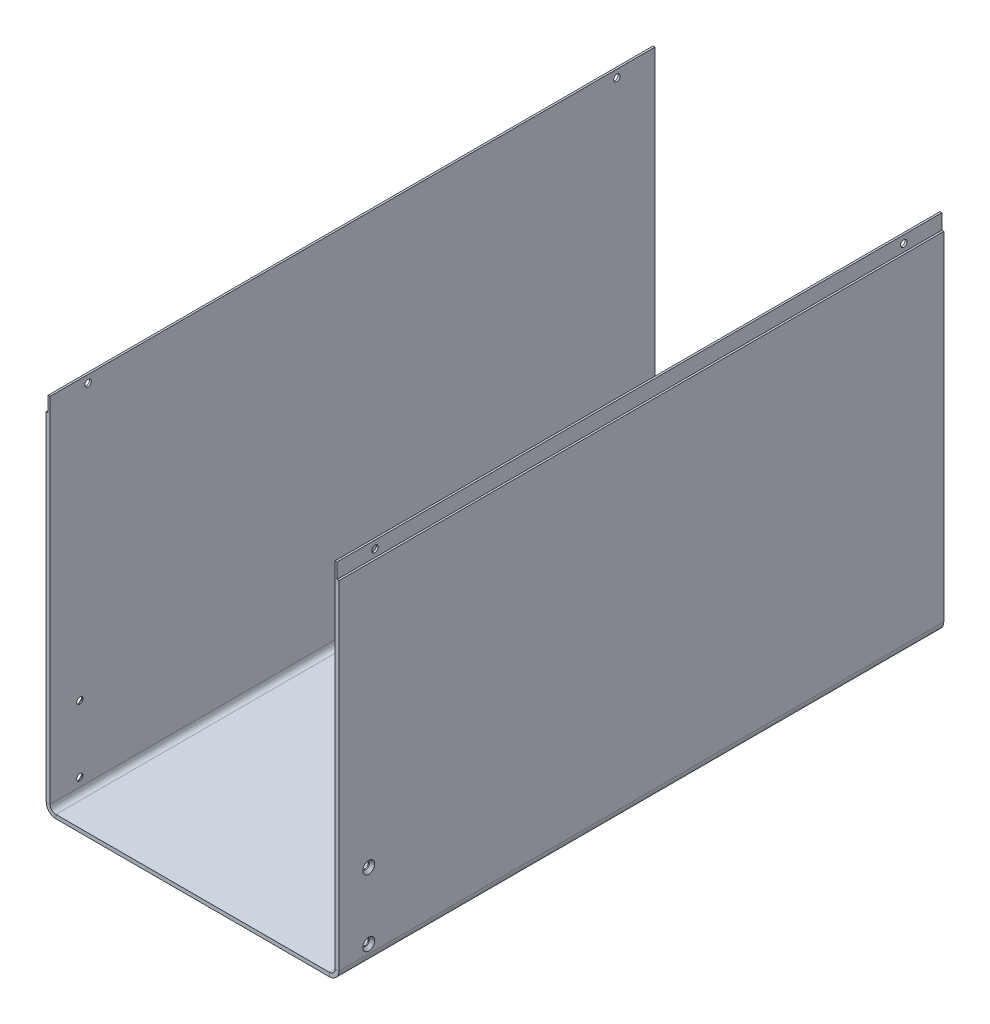
ISO-10303-21;
HEADER;
FILE_DESCRIPTION(('STEP AP214'),'2;1');
FILE_NAME('part.step','',(''),(''),'','','');
FILE_SCHEMA(('AUTOMOTIVE_DESIGN { 1 0 10303 214 1 1 1 1 }'));
ENDSEC;
DATA;
#1=APPLICATION_CONTEXT('core data for automotive mechanical design processes');
#2=APPLICATION_PROTOCOL_DEFINITION('international standard','automotive_design',2000,#1);
#3=PRODUCT_CONTEXT('',#1,'mechanical');
#4=PRODUCT('Part','Part','',(#3));
#5=PRODUCT_RELATED_PRODUCT_CATEGORY('part','',(#4));
#6=PRODUCT_DEFINITION_FORMATION('','',#4);
#7=PRODUCT_DEFINITION_CONTEXT('part definition',#1,'design');
#8=PRODUCT_DEFINITION('design','',#6,#7);
#9=PRODUCT_DEFINITION_SHAPE('','',#8);
#10=(LENGTH_UNIT() NAMED_UNIT(*) SI_UNIT(.MILLI.,.METRE.));
#11=(NAMED_UNIT(*) PLANE_ANGLE_UNIT() SI_UNIT($,.RADIAN.));
#12=(NAMED_UNIT(*) SI_UNIT($,.STERADIAN.) SOLID_ANGLE_UNIT());
#13=UNCERTAINTY_MEASURE_WITH_UNIT(LENGTH_MEASURE(1.E-05),#10,'distance_accuracy_value','');
#14=(GEOMETRIC_REPRESENTATION_CONTEXT(3) GLOBAL_UNCERTAINTY_ASSIGNED_CONTEXT((#13)) GLOBAL_UNIT_ASSIGNED_CONTEXT((#10,
#11,#12)) REPRESENTATION_CONTEXT('',''));
#15=CARTESIAN_POINT('',(0.,0.,0.));
#16=DIRECTION('',(0.,0.,1.));
#17=DIRECTION('',(1.,0.,0.));
#18=AXIS2_PLACEMENT_3D('',#15,#16,#17);
#19=CARTESIAN_POINT('',(-2.032,0.,-318.352799999998));
#20=DIRECTION('',(0.,0.,1.));
#21=DIRECTION('',(1.,0.,0.));
#22=AXIS2_PLACEMENT_3D('',#19,#20,#21);
#23=PLANE('',#22);
#24=DIRECTION('',(-1.,0.,0.));
#25=VECTOR('',#24,1.);
#26=CARTESIAN_POINT('',(-1.01600000000063,181.048,-318.352799999998));
#27=LINE('',#26,#25);
#28=CARTESIAN_POINT('',(-1.01600000000063,181.048,-318.352799999998));
#29=VERTEX_POINT('',#28);
#30=CARTESIAN_POINT('',(-2.03200000000063,181.048,-318.352799999998));
#31=VERTEX_POINT('',#30);
#32=EDGE_CURVE('E170',#29,#31,#27,.T.);
#33=ORIENTED_EDGE('',*,*,#32,.F.);
#34=DIRECTION('',(0.,1.,0.));
#35=VECTOR('',#34,1.);
#36=CARTESIAN_POINT('',(-1.01600000000066,189.048,-318.352799999998));
#37=LINE('',#36,#35);
#38=CARTESIAN_POINT('',(-1.01600000000066,189.048,-318.352799999998));
#39=VERTEX_POINT('',#38);
#40=EDGE_CURVE('E157',#29,#39,#37,.T.);
#41=ORIENTED_EDGE('',*,*,#40,.T.);
#42=DIRECTION('',(1.,0.,0.));
#43=VECTOR('',#42,1.);
#44=CARTESIAN_POINT('',(-2.03200000000066,189.048,-318.352799999998));
#45=LINE('',#44,#43);
#46=CARTESIAN_POINT('',(-6.60057564145617E-13,189.048,-318.352799999998));
#47=VERTEX_POINT('',#46);
#48=EDGE_CURVE('E217',#39,#47,#45,.T.);
#49=ORIENTED_EDGE('',*,*,#48,.T.);
#50=DIRECTION('',(0.,-1.,0.));
#51=VECTOR('',#50,1.);
#52=CARTESIAN_POINT('',(0.,0.,-318.352799999998));
#53=LINE('',#52,#51);
#54=CARTESIAN_POINT('',(0.,3.04799999999999,-318.352799999998));
#55=VERTEX_POINT('',#54);
#56=EDGE_CURVE('E211',#47,#55,#53,.T.);
#57=ORIENTED_EDGE('',*,*,#56,.T.);
#58=DIRECTION('',(-1.,0.,0.));
#59=VECTOR('',#58,1.);
#60=CARTESIAN_POINT('',(0.,3.04799999999999,-318.352799999998));
#61=LINE('',#60,#59);
#62=CARTESIAN_POINT('',(-2.03200000000001,3.04799999999998,-318.352799999998));
#63=VERTEX_POINT('',#62);
#64=EDGE_CURVE('E199',#55,#63,#61,.T.);
#65=ORIENTED_EDGE('',*,*,#64,.T.);
#66=DIRECTION('',(0.,-1.,0.));
#67=VECTOR('',#66,1.);
#68=CARTESIAN_POINT('',(-2.032,0.,-318.352799999998));
#69=LINE('',#68,#67);
#70=EDGE_CURVE('E212',#31,#63,#69,.T.);
#71=ORIENTED_EDGE('',*,*,#70,.F.);
#72=EDGE_LOOP('',(#33,#41,#49,#57,#65,#71));
#73=FACE_BOUND('',#72,.T.);
#74=ADVANCED_FACE('F39',(#73),#23,.F.);
#75=CARTESIAN_POINT('',(-2.03200000000066,189.048,0.));
#76=DIRECTION('',(0.,0.,-1.));
#77=DIRECTION('',(-1.,0.,0.));
#78=AXIS2_PLACEMENT_3D('',#75,#76,#77);
#79=PLANE('',#78);
#80=DIRECTION('',(-1.,0.,0.));
#81=VECTOR('',#80,1.);
#82=CARTESIAN_POINT('',(-1.01600000000063,181.048,-1.1145598333151E-13));
#83=LINE('',#82,#81);
#84=CARTESIAN_POINT('',(-1.01600000000063,181.048,-1.1145598333151E-13));
#85=VERTEX_POINT('',#84);
#86=CARTESIAN_POINT('',(-2.03200000000063,181.048,-1.1145598333151E-13));
#87=VERTEX_POINT('',#86);
#88=EDGE_CURVE('E162',#85,#87,#83,.T.);
#89=ORIENTED_EDGE('',*,*,#88,.T.);
#90=DIRECTION('',(0.,1.,0.));
#91=VECTOR('',#90,1.);
#92=CARTESIAN_POINT('',(-2.03200000000066,189.048,0.));
#93=LINE('',#92,#91);
#94=CARTESIAN_POINT('',(-2.03200000000001,3.04799999999998,0.));
#95=VERTEX_POINT('',#94);
#96=EDGE_CURVE('E214',#95,#87,#93,.T.);
#97=ORIENTED_EDGE('',*,*,#96,.F.);
#98=DIRECTION('',(-1.,0.,0.));
#99=VECTOR('',#98,1.);
#100=CARTESIAN_POINT('',(0.,3.04799999999999,0.));
#101=LINE('',#100,#99);
#102=CARTESIAN_POINT('',(0.,3.04799999999999,0.));
#103=VERTEX_POINT('',#102);
#104=EDGE_CURVE('E203',#103,#95,#101,.T.);
#105=ORIENTED_EDGE('',*,*,#104,.F.);
#106=DIRECTION('',(0.,1.,0.));
#107=VECTOR('',#106,1.);
#108=CARTESIAN_POINT('',(-6.60057564145617E-13,189.048,0.));
#109=LINE('',#108,#107);
#110=CARTESIAN_POINT('',(-6.60057564145617E-13,189.048,0.));
#111=VERTEX_POINT('',#110);
#112=EDGE_CURVE('E220',#103,#111,#109,.T.);
#113=ORIENTED_EDGE('',*,*,#112,.T.);
#114=DIRECTION('',(1.,0.,0.));
#115=VECTOR('',#114,1.);
#116=CARTESIAN_POINT('',(-2.03200000000066,189.048,0.));
#117=LINE('',#116,#115);
#118=CARTESIAN_POINT('',(-1.01600000000066,189.048,0.));
#119=VERTEX_POINT('',#118);
#120=EDGE_CURVE('E175',#119,#111,#117,.T.);
#121=ORIENTED_EDGE('',*,*,#120,.F.);
#122=DIRECTION('',(0.,-1.,0.));
#123=VECTOR('',#122,1.);
#124=CARTESIAN_POINT('',(-1.01600000000066,189.048,-1.11022302462516E-13));
#125=LINE('',#124,#123);
#126=EDGE_CURVE('E56',#119,#85,#125,.T.);
#127=ORIENTED_EDGE('',*,*,#126,.T.);
#128=EDGE_LOOP('',(#89,#97,#105,#113,#121,#127));
#129=FACE_BOUND('',#128,.T.);
#130=ADVANCED_FACE('F173',(#129),#79,.F.);
#131=CARTESIAN_POINT('',(-2.032,0.,0.));
#132=DIRECTION('',(1.,0.,0.));
#133=DIRECTION('',(0.,1.,0.));
#134=AXIS2_PLACEMENT_3D('',#131,#132,#133);
#135=PLANE('',#134);
#136=CARTESIAN_POINT('',(-2.03200000000015,42.4999999999976,-15.7003999999974));
#137=DIRECTION('',(-1.,0.,0.));
#138=DIRECTION('',(0.,0.,1.));
#139=AXIS2_PLACEMENT_3D('',#136,#137,#138);
#140=CIRCLE('',#139,3.15);
#141=CARTESIAN_POINT('',(-2.03200000000015,42.4999999999976,-12.5503999999974));
#142=VERTEX_POINT('',#141);
#143=EDGE_CURVE('E756',#142,#142,#140,.T.);
#144=ORIENTED_EDGE('',*,*,#143,.F.);
#145=EDGE_LOOP('',(#144));
#146=FACE_BOUND('',#145,.T.);
#147=CARTESIAN_POINT('',(-2.03200000000003,7.49999999999755,-15.7003999999974));
#148=DIRECTION('',(-1.,0.,0.));
#149=DIRECTION('',(0.,0.,1.));
#150=AXIS2_PLACEMENT_3D('',#147,#148,#149);
#151=CIRCLE('',#150,3.15);
#152=CARTESIAN_POINT('',(-2.03200000000003,7.49999999999755,-12.5503999999974));
#153=VERTEX_POINT('',#152);
#154=EDGE_CURVE('E760',#153,#153,#151,.T.);
#155=ORIENTED_EDGE('',*,*,#154,.F.);
#156=EDGE_LOOP('',(#155));
#157=FACE_BOUND('',#156,.T.);
#158=DIRECTION('',(0.,0.,-1.));
#159=VECTOR('',#158,1.);
#160=CARTESIAN_POINT('',(-2.03200000000063,181.048,-1.1145598333151E-13));
#161=LINE('',#160,#159);
#162=EDGE_CURVE('E165',#87,#31,#161,.T.);
#163=ORIENTED_EDGE('',*,*,#162,.T.);
#164=ORIENTED_EDGE('',*,*,#70,.T.);
#165=DIRECTION('',(0.,0.,-1.));
#166=VECTOR('',#165,1.);
#167=CARTESIAN_POINT('',(-2.03200000000001,3.04799999999998,0.));
#168=LINE('',#167,#166);
#169=EDGE_CURVE('E206',#95,#63,#168,.T.);
#170=ORIENTED_EDGE('',*,*,#169,.F.);
#171=ORIENTED_EDGE('',*,*,#96,.T.);
#172=EDGE_LOOP('',(#163,#164,#170,#171));
#173=FACE_BOUND('',#172,.T.);
#174=ADVANCED_FACE('F380',(#146,#157,#173),#135,.F.);
#175=CARTESIAN_POINT('',(152.032000000001,189.048,0.));
#176=DIRECTION('',(0.,-1.,0.));
#177=DIRECTION('',(1.,0.,0.));
#178=AXIS2_PLACEMENT_3D('',#175,#176,#177);
#179=PLANE('',#178);
#180=DIRECTION('',(0.,0.,1.));
#181=VECTOR('',#180,1.);
#182=CARTESIAN_POINT('',(151.016000000001,189.048,0.));
#183=LINE('',#182,#181);
#184=CARTESIAN_POINT('',(151.016000000001,189.048,-318.352799999998));
#185=VERTEX_POINT('',#184);
#186=CARTESIAN_POINT('',(151.016000000001,189.048,0.));
#187=VERTEX_POINT('',#186);
#188=EDGE_CURVE('E192',#185,#187,#183,.T.);
#189=ORIENTED_EDGE('',*,*,#188,.F.);
#190=DIRECTION('',(-1.,0.,0.));
#191=VECTOR('',#190,1.);
#192=CARTESIAN_POINT('',(152.032000000001,189.048,-318.352799999998));
#193=LINE('',#192,#191);
#194=CARTESIAN_POINT('',(150.000000000001,189.048,-318.352799999998));
#195=VERTEX_POINT('',#194);
#196=EDGE_CURVE('E276',#185,#195,#193,.T.);
#197=ORIENTED_EDGE('',*,*,#196,.T.);
#198=DIRECTION('',(0.,0.,1.));
#199=VECTOR('',#198,1.);
#200=CARTESIAN_POINT('',(150.000000000001,189.048,0.));
#201=LINE('',#200,#199);
#202=CARTESIAN_POINT('',(150.000000000001,189.048,0.));
#203=VERTEX_POINT('',#202);
#204=EDGE_CURVE('E270',#195,#203,#201,.T.);
#205=ORIENTED_EDGE('',*,*,#204,.T.);
#206=DIRECTION('',(-1.,0.,0.));
#207=VECTOR('',#206,1.);
#208=CARTESIAN_POINT('',(152.032000000001,189.048,0.));
#209=LINE('',#208,#207);
#210=EDGE_CURVE('E267',#187,#203,#209,.T.);
#211=ORIENTED_EDGE('',*,*,#210,.F.);
#212=EDGE_LOOP('',(#189,#197,#205,#211));
#213=FACE_BOUND('',#212,.T.);
#214=ADVANCED_FACE('F351',(#213),#179,.F.);
#215=CARTESIAN_POINT('',(0.,-2.032,0.));
#216=DIRECTION('',(0.,-1.,0.));
#217=DIRECTION('',(0.,0.,-1.));
#218=AXIS2_PLACEMENT_3D('',#215,#216,#217);
#219=PLANE('',#218);
#220=DIRECTION('',(1.,0.,0.));
#221=VECTOR('',#220,1.);
#222=CARTESIAN_POINT('',(0.,-2.032,0.));
#223=LINE('',#222,#221);
#224=CARTESIAN_POINT('',(3.048,-2.03200000000001,0.));
#225=VERTEX_POINT('',#224);
#226=CARTESIAN_POINT('',(146.952,-2.032,0.));
#227=VERTEX_POINT('',#226);
#228=EDGE_CURVE('E48',#225,#227,#223,.T.);
#229=ORIENTED_EDGE('',*,*,#228,.F.);
#230=DIRECTION('',(0.,0.,1.));
#231=VECTOR('',#230,1.);
#232=CARTESIAN_POINT('',(3.048,-2.03200000000001,0.));
#233=LINE('',#232,#231);
#234=CARTESIAN_POINT('',(3.04800000000001,-2.032,-318.352799999998));
#235=VERTEX_POINT('',#234);
#236=EDGE_CURVE('E227',#225,#235,#233,.F.);
#237=ORIENTED_EDGE('',*,*,#236,.T.);
#238=DIRECTION('',(-1.,0.,0.));
#239=VECTOR('',#238,1.);
#240=CARTESIAN_POINT('',(0.,-2.032,-318.352799999998));
#241=LINE('',#240,#239);
#242=CARTESIAN_POINT('',(146.952,-2.03199999999996,-318.352799999998));
#243=VERTEX_POINT('',#242);
#244=EDGE_CURVE('E11',#243,#235,#241,.T.);
#245=ORIENTED_EDGE('',*,*,#244,.F.);
#246=DIRECTION('',(0.,0.,-1.));
#247=VECTOR('',#246,1.);
#248=CARTESIAN_POINT('',(146.952,-2.03199999999996,-318.352799999998));
#249=LINE('',#248,#247);
#250=EDGE_CURVE('E279',#243,#227,#249,.F.);
#251=ORIENTED_EDGE('',*,*,#250,.T.);
#252=EDGE_LOOP('',(#229,#237,#245,#251));
#253=FACE_BOUND('',#252,.T.);
#254=ADVANCED_FACE('F322',(#253),#219,.T.);
#255=CARTESIAN_POINT('',(0.,0.,0.));
#256=DIRECTION('',(0.,-1.,0.));
#257=DIRECTION('',(0.,0.,-1.));
#258=AXIS2_PLACEMENT_3D('',#255,#256,#257);
#259=PLANE('',#258);
#260=DIRECTION('',(0.,0.,1.));
#261=VECTOR('',#260,1.);
#262=CARTESIAN_POINT('',(3.04799999999999,0.,0.));
#263=LINE('',#262,#261);
#264=CARTESIAN_POINT('',(3.04799999999999,0.,0.));
#265=VERTEX_POINT('',#264);
#266=CARTESIAN_POINT('',(3.04800000000001,0.,-318.352799999998));
#267=VERTEX_POINT('',#266);
#268=EDGE_CURVE('E240',#265,#267,#263,.F.);
#269=ORIENTED_EDGE('',*,*,#268,.F.);
#270=DIRECTION('',(1.,0.,0.));
#271=VECTOR('',#270,1.);
#272=CARTESIAN_POINT('',(0.,0.,0.));
#273=LINE('',#272,#271);
#274=CARTESIAN_POINT('',(146.952,0.,0.));
#275=VERTEX_POINT('',#274);
#276=EDGE_CURVE('E299',#265,#275,#273,.T.);
#277=ORIENTED_EDGE('',*,*,#276,.T.);
#278=DIRECTION('',(0.,0.,-1.));
#279=VECTOR('',#278,1.);
#280=CARTESIAN_POINT('',(146.952,0.,-318.352799999998));
#281=LINE('',#280,#279);
#282=CARTESIAN_POINT('',(146.952,0.,-318.352799999998));
#283=VERTEX_POINT('',#282);
#284=EDGE_CURVE('E292',#283,#275,#281,.F.);
#285=ORIENTED_EDGE('',*,*,#284,.F.);
#286=DIRECTION('',(-1.,0.,0.));
#287=VECTOR('',#286,1.);
#288=CARTESIAN_POINT('',(0.,0.,-318.352799999998));
#289=LINE('',#288,#287);
#290=EDGE_CURVE('E303',#283,#267,#289,.T.);
#291=ORIENTED_EDGE('',*,*,#290,.T.);
#292=EDGE_LOOP('',(#269,#277,#285,#291));
#293=FACE_BOUND('',#292,.T.);
#294=ADVANCED_FACE('F311',(#293),#259,.F.);
#295=CARTESIAN_POINT('',(0.,-2.032,0.));
#296=DIRECTION('',(0.,0.,1.));
#297=DIRECTION('',(1.,0.,0.));
#298=AXIS2_PLACEMENT_3D('',#295,#296,#297);
#299=PLANE('',#298);
#300=ORIENTED_EDGE('',*,*,#276,.F.);
#301=DIRECTION('',(0.,-1.,0.));
#302=VECTOR('',#301,1.);
#303=CARTESIAN_POINT('',(3.04799999999999,0.,0.));
#304=LINE('',#303,#302);
#305=EDGE_CURVE('E234',#265,#225,#304,.T.);
#306=ORIENTED_EDGE('',*,*,#305,.T.);
#307=ORIENTED_EDGE('',*,*,#228,.T.);
#308=DIRECTION('',(0.,-1.,0.));
#309=VECTOR('',#308,1.);
#310=CARTESIAN_POINT('',(146.952,0.,0.));
#311=LINE('',#310,#309);
#312=EDGE_CURVE('E296',#275,#227,#311,.T.);
#313=ORIENTED_EDGE('',*,*,#312,.F.);
#314=EDGE_LOOP('',(#300,#306,#307,#313));
#315=FACE_BOUND('',#314,.T.);
#316=ADVANCED_FACE('F41',(#315),#299,.T.);
#317=CARTESIAN_POINT('',(0.,-2.032,-318.352799999998));
#318=DIRECTION('',(0.,0.,-1.));
#319=DIRECTION('',(-1.,0.,0.));
#320=AXIS2_PLACEMENT_3D('',#317,#318,#319);
#321=PLANE('',#320);
#322=DIRECTION('',(0.,-1.,0.));
#323=VECTOR('',#322,1.);
#324=CARTESIAN_POINT('',(3.04800000000001,0.,-318.352799999998));
#325=LINE('',#324,#323);
#326=EDGE_CURVE('E244',#267,#235,#325,.T.);
#327=ORIENTED_EDGE('',*,*,#326,.F.);
#328=ORIENTED_EDGE('',*,*,#290,.F.);
#329=DIRECTION('',(0.,-1.,0.));
#330=VECTOR('',#329,1.);
#331=CARTESIAN_POINT('',(146.952,0.,-318.352799999998));
#332=LINE('',#331,#330);
#333=EDGE_CURVE('E286',#283,#243,#332,.T.);
#334=ORIENTED_EDGE('',*,*,#333,.T.);
#335=ORIENTED_EDGE('',*,*,#244,.T.);
#336=EDGE_LOOP('',(#327,#328,#334,#335));
#337=FACE_BOUND('',#336,.T.);
#338=ADVANCED_FACE('F315',(#337),#321,.T.);
#339=CARTESIAN_POINT('',(146.952,3.04800000000001,0.));
#340=DIRECTION('',(0.,0.,1.));
#341=DIRECTION('',(1.,0.,0.));
#342=AXIS2_PLACEMENT_3D('',#339,#340,#341);
#343=PLANE('',#342);
#344=DIRECTION('',(1.,0.,0.));
#345=VECTOR('',#344,1.);
#346=CARTESIAN_POINT('',(150.,3.048,0.));
#347=LINE('',#346,#345);
#348=CARTESIAN_POINT('',(150.,3.048,0.));
#349=VERTEX_POINT('',#348);
#350=CARTESIAN_POINT('',(152.032,3.04799999999999,0.));
#351=VERTEX_POINT('',#350);
#352=EDGE_CURVE('E247',#349,#351,#347,.T.);
#353=ORIENTED_EDGE('',*,*,#352,.F.);
#354=CARTESIAN_POINT('',(146.952,3.04800000000001,0.));
#355=DIRECTION('',(0.,0.,-1.));
#356=DIRECTION('',(-1.,0.,0.));
#357=AXIS2_PLACEMENT_3D('',#354,#355,#356);
#358=CIRCLE('',#357,3.04799999999997);
#359=EDGE_CURVE('E289',#275,#349,#358,.F.);
#360=ORIENTED_EDGE('',*,*,#359,.F.);
#361=ORIENTED_EDGE('',*,*,#312,.T.);
#362=CARTESIAN_POINT('',(146.952,3.04800000000001,0.));
#363=DIRECTION('',(0.,0.,-1.));
#364=DIRECTION('',(-1.,0.,0.));
#365=AXIS2_PLACEMENT_3D('',#362,#363,#364);
#366=CIRCLE('',#365,5.07999999999997);
#367=EDGE_CURVE('E282',#227,#351,#366,.F.);
#368=ORIENTED_EDGE('',*,*,#367,.T.);
#369=EDGE_LOOP('',(#353,#360,#361,#368));
#370=FACE_BOUND('',#369,.T.);
#371=ADVANCED_FACE('F334',(#370),#343,.T.);
#372=CARTESIAN_POINT('',(146.952,3.04800000000001,-318.352799999998));
#373=DIRECTION('',(0.,0.,1.));
#374=DIRECTION('',(1.,0.,0.));
#375=AXIS2_PLACEMENT_3D('',#372,#373,#374);
#376=PLANE('',#375);
#377=CARTESIAN_POINT('',(146.952,3.04800000000001,-318.352799999998));
#378=DIRECTION('',(0.,0.,-1.));
#379=DIRECTION('',(-1.,0.,0.));
#380=AXIS2_PLACEMENT_3D('',#377,#378,#379);
#381=CIRCLE('',#380,3.04799999999997);
#382=CARTESIAN_POINT('',(150.,3.048,-318.352799999998));
#383=VERTEX_POINT('',#382);
#384=EDGE_CURVE('E278',#383,#283,#381,.T.);
#385=ORIENTED_EDGE('',*,*,#384,.F.);
#386=DIRECTION('',(1.,0.,0.));
#387=VECTOR('',#386,1.);
#388=CARTESIAN_POINT('',(150.,3.048,-318.352799999998));
#389=LINE('',#388,#387);
#390=CARTESIAN_POINT('',(152.032,3.04799999999999,-318.352799999998));
#391=VERTEX_POINT('',#390);
#392=EDGE_CURVE('E252',#383,#391,#389,.T.);
#393=ORIENTED_EDGE('',*,*,#392,.T.);
#394=CARTESIAN_POINT('',(146.952,3.04800000000001,-318.352799999998));
#395=DIRECTION('',(0.,0.,-1.));
#396=DIRECTION('',(-1.,0.,0.));
#397=AXIS2_PLACEMENT_3D('',#394,#395,#396);
#398=CIRCLE('',#397,5.07999999999997);
#399=EDGE_CURVE('E283',#391,#243,#398,.T.);
#400=ORIENTED_EDGE('',*,*,#399,.T.);
#401=ORIENTED_EDGE('',*,*,#333,.F.);
#402=EDGE_LOOP('',(#385,#393,#400,#401));
#403=FACE_BOUND('',#402,.T.);
#404=ADVANCED_FACE('F359',(#403),#376,.F.);
#405=CARTESIAN_POINT('',(146.952,3.04800000000001,-318.352799999998));
#406=DIRECTION('',(0.,0.,-1.));
#407=DIRECTION('',(1.,0.,0.));
#408=AXIS2_PLACEMENT_3D('',#405,#406,#407);
#409=CYLINDRICAL_SURFACE('',#408,5.07999999999997);
#410=ORIENTED_EDGE('',*,*,#250,.F.);
#411=ORIENTED_EDGE('',*,*,#399,.F.);
#412=DIRECTION('',(0.,0.,1.));
#413=VECTOR('',#412,1.);
#414=CARTESIAN_POINT('',(152.032,3.04799999999999,0.));
#415=LINE('',#414,#413);
#416=EDGE_CURVE('E255',#391,#351,#415,.T.);
#417=ORIENTED_EDGE('',*,*,#416,.T.);
#418=ORIENTED_EDGE('',*,*,#367,.F.);
#419=EDGE_LOOP('',(#410,#411,#417,#418));
#420=FACE_BOUND('',#419,.T.);
#421=ADVANCED_FACE('F364',(#420),#409,.T.);
#422=CARTESIAN_POINT('',(146.952,3.04800000000001,-318.352799999998));
#423=DIRECTION('',(0.,0.,-1.));
#424=DIRECTION('',(1.,0.,0.));
#425=AXIS2_PLACEMENT_3D('',#422,#423,#424);
#426=CYLINDRICAL_SURFACE('',#425,3.04799999999997);
#427=ORIENTED_EDGE('',*,*,#284,.T.);
#428=ORIENTED_EDGE('',*,*,#359,.T.);
#429=DIRECTION('',(0.,0.,-1.));
#430=VECTOR('',#429,1.);
#431=CARTESIAN_POINT('',(150.,3.048,0.));
#432=LINE('',#431,#430);
#433=EDGE_CURVE('E250',#349,#383,#432,.T.);
#434=ORIENTED_EDGE('',*,*,#433,.T.);
#435=ORIENTED_EDGE('',*,*,#384,.T.);
#436=EDGE_LOOP('',(#427,#428,#434,#435));
#437=FACE_BOUND('',#436,.T.);
#438=ADVANCED_FACE('F337',(#437),#426,.F.);
#439=CARTESIAN_POINT('',(152.032000000001,189.048,-318.352799999998));
#440=DIRECTION('',(0.,0.,1.));
#441=DIRECTION('',(1.,0.,0.));
#442=AXIS2_PLACEMENT_3D('',#439,#440,#441);
#443=PLANE('',#442);
#444=DIRECTION('',(0.,1.,0.));
#445=VECTOR('',#444,1.);
#446=CARTESIAN_POINT('',(151.016000000001,189.048,-318.352799999998));
#447=LINE('',#446,#445);
#448=CARTESIAN_POINT('',(151.016000000001,181.048,-318.352799999998));
#449=VERTEX_POINT('',#448);
#450=EDGE_CURVE('E64',#449,#185,#447,.T.);
#451=ORIENTED_EDGE('',*,*,#450,.F.);
#452=DIRECTION('',(1.,0.,0.));
#453=VECTOR('',#452,1.);
#454=CARTESIAN_POINT('',(151.016000000001,181.048,-318.352799999998));
#455=LINE('',#454,#453);
#456=CARTESIAN_POINT('',(152.032000000001,181.048,-318.352799999998));
#457=VERTEX_POINT('',#456);
#458=EDGE_CURVE('E196',#449,#457,#455,.T.);
#459=ORIENTED_EDGE('',*,*,#458,.T.);
#460=DIRECTION('',(0.,1.,0.));
#461=VECTOR('',#460,1.);
#462=CARTESIAN_POINT('',(152.032000000001,189.048,-318.352799999998));
#463=LINE('',#462,#461);
#464=EDGE_CURVE('E261',#391,#457,#463,.T.);
#465=ORIENTED_EDGE('',*,*,#464,.F.);
#466=ORIENTED_EDGE('',*,*,#392,.F.);
#467=DIRECTION('',(0.,1.,0.));
#468=VECTOR('',#467,1.);
#469=CARTESIAN_POINT('',(150.000000000001,189.048,-318.352799999998));
#470=LINE('',#469,#468);
#471=EDGE_CURVE('E260',#383,#195,#470,.T.);
#472=ORIENTED_EDGE('',*,*,#471,.T.);
#473=ORIENTED_EDGE('',*,*,#196,.F.);
#474=EDGE_LOOP('',(#451,#459,#465,#466,#472,#473));
#475=FACE_BOUND('',#474,.T.);
#476=ADVANCED_FACE('F355',(#475),#443,.F.);
#477=CARTESIAN_POINT('',(152.032,0.,0.));
#478=DIRECTION('',(0.,0.,-1.));
#479=DIRECTION('',(-1.,0.,0.));
#480=AXIS2_PLACEMENT_3D('',#477,#478,#479);
#481=PLANE('',#480);
#482=DIRECTION('',(0.,-1.,0.));
#483=VECTOR('',#482,1.);
#484=CARTESIAN_POINT('',(152.032,0.,0.));
#485=LINE('',#484,#483);
#486=CARTESIAN_POINT('',(152.032000000001,181.048,0.));
#487=VERTEX_POINT('',#486);
#488=EDGE_CURVE('E264',#487,#351,#485,.T.);
#489=ORIENTED_EDGE('',*,*,#488,.F.);
#490=DIRECTION('',(1.,0.,0.));
#491=VECTOR('',#490,1.);
#492=CARTESIAN_POINT('',(151.016000000001,181.048,0.));
#493=LINE('',#492,#491);
#494=CARTESIAN_POINT('',(151.016000000001,181.048,0.));
#495=VERTEX_POINT('',#494);
#496=EDGE_CURVE('E194',#495,#487,#493,.T.);
#497=ORIENTED_EDGE('',*,*,#496,.F.);
#498=DIRECTION('',(0.,-1.,0.));
#499=VECTOR('',#498,1.);
#500=CARTESIAN_POINT('',(151.016000000001,189.048,0.));
#501=LINE('',#500,#499);
#502=EDGE_CURVE('E186',#187,#495,#501,.T.);
#503=ORIENTED_EDGE('',*,*,#502,.F.);
#504=ORIENTED_EDGE('',*,*,#210,.T.);
#505=DIRECTION('',(0.,-1.,0.));
#506=VECTOR('',#505,1.);
#507=CARTESIAN_POINT('',(150.,0.,0.));
#508=LINE('',#507,#506);
#509=EDGE_CURVE('E265',#203,#349,#508,.T.);
#510=ORIENTED_EDGE('',*,*,#509,.T.);
#511=ORIENTED_EDGE('',*,*,#352,.T.);
#512=EDGE_LOOP('',(#489,#497,#503,#504,#510,#511));
#513=FACE_BOUND('',#512,.T.);
#514=ADVANCED_FACE('F346',(#513),#481,.F.);
#515=CARTESIAN_POINT('',(152.032,-5.35638087610596E-13,0.));
#516=DIRECTION('',(-1.,0.,0.));
#517=DIRECTION('',(0.,-1.,0.));
#518=AXIS2_PLACEMENT_3D('',#515,#516,#517);
#519=PLANE('',#518);
#520=CARTESIAN_POINT('',(152.032,42.499999999997,-15.7003999999974));
#521=DIRECTION('',(1.,0.,0.));
#522=DIRECTION('',(0.,0.,-1.));
#523=AXIS2_PLACEMENT_3D('',#520,#521,#522);
#524=CIRCLE('',#523,3.15);
#525=CARTESIAN_POINT('',(152.032,42.499999999997,-18.8503999999974));
#526=VERTEX_POINT('',#525);
#527=EDGE_CURVE('E782',#526,#526,#524,.T.);
#528=ORIENTED_EDGE('',*,*,#527,.F.);
#529=EDGE_LOOP('',(#528));
#530=FACE_BOUND('',#529,.T.);
#531=CARTESIAN_POINT('',(152.032,7.49999999999701,-15.7003999999974));
#532=DIRECTION('',(1.,0.,0.));
#533=DIRECTION('',(0.,0.,-1.));
#534=AXIS2_PLACEMENT_3D('',#531,#532,#533);
#535=CIRCLE('',#534,3.15);
#536=CARTESIAN_POINT('',(152.032,7.49999999999701,-18.8503999999974));
#537=VERTEX_POINT('',#536);
#538=EDGE_CURVE('E791',#537,#537,#535,.T.);
#539=ORIENTED_EDGE('',*,*,#538,.F.);
#540=EDGE_LOOP('',(#539));
#541=FACE_BOUND('',#540,.T.);
#542=ORIENTED_EDGE('',*,*,#464,.T.);
#543=DIRECTION('',(0.,0.,-1.));
#544=VECTOR('',#543,1.);
#545=CARTESIAN_POINT('',(152.032000000001,181.048,0.));
#546=LINE('',#545,#544);
#547=EDGE_CURVE('E169',#487,#457,#546,.T.);
#548=ORIENTED_EDGE('',*,*,#547,.F.);
#549=ORIENTED_EDGE('',*,*,#488,.T.);
#550=ORIENTED_EDGE('',*,*,#416,.F.);
#551=EDGE_LOOP('',(#542,#548,#549,#550));
#552=FACE_BOUND('',#551,.T.);
#553=ADVANCED_FACE('F361',(#530,#541,#552),#519,.F.);
#554=CARTESIAN_POINT('',(150.,-5.28543397530067E-13,0.));
#555=DIRECTION('',(-1.,0.,0.));
#556=DIRECTION('',(0.,-1.,0.));
#557=AXIS2_PLACEMENT_3D('',#554,#555,#556);
#558=PLANE('',#557);
#559=CARTESIAN_POINT('',(150.,42.499999999997,-15.7003999999974));
#560=DIRECTION('',(-1.,0.,0.));
#561=DIRECTION('',(0.,-1.,0.));
#562=AXIS2_PLACEMENT_3D('',#559,#560,#561);
#563=CIRCLE('',#562,1.7);
#564=CARTESIAN_POINT('',(150.,40.799999999997,-15.7003999999974));
#565=VERTEX_POINT('',#564);
#566=EDGE_CURVE('E788',#565,#565,#563,.T.);
#567=ORIENTED_EDGE('',*,*,#566,.F.);
#568=EDGE_LOOP('',(#567));
#569=FACE_BOUND('',#568,.T.);
#570=CARTESIAN_POINT('',(150.,7.49999999999701,-15.7003999999974));
#571=DIRECTION('',(-1.,0.,0.));
#572=DIRECTION('',(0.,-1.,0.));
#573=AXIS2_PLACEMENT_3D('',#570,#571,#572);
#574=CIRCLE('',#573,1.7);
#575=CARTESIAN_POINT('',(150.,5.79999999999701,-15.7003999999974));
#576=VERTEX_POINT('',#575);
#577=EDGE_CURVE('E797',#576,#576,#574,.T.);
#578=ORIENTED_EDGE('',*,*,#577,.F.);
#579=EDGE_LOOP('',(#578));
#580=FACE_BOUND('',#579,.T.);
#581=CARTESIAN_POINT('',(150.000000000001,185.048,-20.0033246567379));
#582=DIRECTION('',(-1.,0.,0.));
#583=DIRECTION('',(0.,-1.,0.));
#584=AXIS2_PLACEMENT_3D('',#581,#582,#583);
#585=CIRCLE('',#584,1.69999999999997);
#586=CARTESIAN_POINT('',(150.000000000001,183.348,-20.0033246567379));
#587=VERTEX_POINT('',#586);
#588=EDGE_CURVE('E803',#587,#587,#585,.T.);
#589=ORIENTED_EDGE('',*,*,#588,.F.);
#590=EDGE_LOOP('',(#589));
#591=FACE_BOUND('',#590,.T.);
#592=CARTESIAN_POINT('',(150.000000000001,185.048,-298.352799999998));
#593=DIRECTION('',(-1.,0.,0.));
#594=DIRECTION('',(0.,-1.,0.));
#595=AXIS2_PLACEMENT_3D('',#592,#593,#594);
#596=CIRCLE('',#595,1.69999999999997);
#597=CARTESIAN_POINT('',(150.000000000001,183.348,-298.352799999998));
#598=VERTEX_POINT('',#597);
#599=EDGE_CURVE('E177',#598,#598,#596,.T.);
#600=ORIENTED_EDGE('',*,*,#599,.F.);
#601=EDGE_LOOP('',(#600));
#602=FACE_BOUND('',#601,.T.);
#603=ORIENTED_EDGE('',*,*,#471,.F.);
#604=ORIENTED_EDGE('',*,*,#433,.F.);
#605=ORIENTED_EDGE('',*,*,#509,.F.);
#606=ORIENTED_EDGE('',*,*,#204,.F.);
#607=EDGE_LOOP('',(#603,#604,#605,#606));
#608=FACE_BOUND('',#607,.T.);
#609=ADVANCED_FACE('F342',(#569,#580,#591,#602,#608),#558,.T.);
#610=CARTESIAN_POINT('',(3.048,3.048,-318.352799999998));
#611=DIRECTION('',(0.,0.,-1.));
#612=DIRECTION('',(-1.,0.,0.));
#613=AXIS2_PLACEMENT_3D('',#610,#611,#612);
#614=PLANE('',#613);
#615=ORIENTED_EDGE('',*,*,#64,.F.);
#616=CARTESIAN_POINT('',(3.048,3.048,-318.352799999998));
#617=DIRECTION('',(0.,0.,1.));
#618=DIRECTION('',(1.,0.,0.));
#619=AXIS2_PLACEMENT_3D('',#616,#617,#618);
#620=CIRCLE('',#619,3.04800000000001);
#621=EDGE_CURVE('E237',#267,#55,#620,.F.);
#622=ORIENTED_EDGE('',*,*,#621,.F.);
#623=ORIENTED_EDGE('',*,*,#326,.T.);
#624=CARTESIAN_POINT('',(3.048,3.048,-318.352799999998));
#625=DIRECTION('',(0.,0.,1.));
#626=DIRECTION('',(1.,0.,0.));
#627=AXIS2_PLACEMENT_3D('',#624,#625,#626);
#628=CIRCLE('',#627,5.08000000000001);
#629=EDGE_CURVE('E230',#235,#63,#628,.F.);
#630=ORIENTED_EDGE('',*,*,#629,.T.);
#631=EDGE_LOOP('',(#615,#622,#623,#630));
#632=FACE_BOUND('',#631,.T.);
#633=ADVANCED_FACE('F319',(#632),#614,.T.);
#634=CARTESIAN_POINT('',(3.04799999999998,3.048,0.));
#635=DIRECTION('',(0.,0.,-1.));
#636=DIRECTION('',(-1.,0.,0.));
#637=AXIS2_PLACEMENT_3D('',#634,#635,#636);
#638=PLANE('',#637);
#639=CARTESIAN_POINT('',(3.04799999999998,3.048,0.));
#640=DIRECTION('',(0.,0.,1.));
#641=DIRECTION('',(1.,0.,0.));
#642=AXIS2_PLACEMENT_3D('',#639,#640,#641);
#643=CIRCLE('',#642,3.04800000000001);
#644=EDGE_CURVE('E226',#103,#265,#643,.T.);
#645=ORIENTED_EDGE('',*,*,#644,.F.);
#646=ORIENTED_EDGE('',*,*,#104,.T.);
#647=CARTESIAN_POINT('',(3.04799999999998,3.048,0.));
#648=DIRECTION('',(0.,0.,1.));
#649=DIRECTION('',(1.,0.,0.));
#650=AXIS2_PLACEMENT_3D('',#647,#648,#649);
#651=CIRCLE('',#650,5.08000000000001);
#652=EDGE_CURVE('E231',#95,#225,#651,.T.);
#653=ORIENTED_EDGE('',*,*,#652,.T.);
#654=ORIENTED_EDGE('',*,*,#305,.F.);
#655=EDGE_LOOP('',(#645,#646,#653,#654));
#656=FACE_BOUND('',#655,.T.);
#657=ADVANCED_FACE('F327',(#656),#638,.F.);
#658=CARTESIAN_POINT('',(3.04799999999998,3.048,0.));
#659=DIRECTION('',(0.,0.,1.));
#660=DIRECTION('',(-1.,0.,0.));
#661=AXIS2_PLACEMENT_3D('',#658,#659,#660);
#662=CYLINDRICAL_SURFACE('',#661,5.08000000000001);
#663=ORIENTED_EDGE('',*,*,#236,.F.);
#664=ORIENTED_EDGE('',*,*,#652,.F.);
#665=ORIENTED_EDGE('',*,*,#169,.T.);
#666=ORIENTED_EDGE('',*,*,#629,.F.);
#667=EDGE_LOOP('',(#663,#664,#665,#666));
#668=FACE_BOUND('',#667,.T.);
#669=ADVANCED_FACE('F324',(#668),#662,.T.);
#670=CARTESIAN_POINT('',(3.04799999999998,3.048,0.));
#671=DIRECTION('',(0.,0.,1.));
#672=DIRECTION('',(-1.,0.,0.));
#673=AXIS2_PLACEMENT_3D('',#670,#671,#672);
#674=CYLINDRICAL_SURFACE('',#673,3.04800000000001);
#675=ORIENTED_EDGE('',*,*,#268,.T.);
#676=ORIENTED_EDGE('',*,*,#621,.T.);
#677=DIRECTION('',(0.,0.,1.));
#678=VECTOR('',#677,1.);
#679=CARTESIAN_POINT('',(0.,3.04799999999999,-318.352799999998));
#680=LINE('',#679,#678);
#681=EDGE_CURVE('E201',#55,#103,#680,.T.);
#682=ORIENTED_EDGE('',*,*,#681,.T.);
#683=ORIENTED_EDGE('',*,*,#644,.T.);
#684=EDGE_LOOP('',(#675,#676,#682,#683));
#685=FACE_BOUND('',#684,.T.);
#686=ADVANCED_FACE('F386',(#685),#674,.F.);
#687=CARTESIAN_POINT('',(0.,0.,0.));
#688=DIRECTION('',(1.,0.,0.));
#689=DIRECTION('',(0.,1.,0.));
#690=AXIS2_PLACEMENT_3D('',#687,#688,#689);
#691=PLANE('',#690);
#692=CARTESIAN_POINT('',(-1.48318857196017E-13,42.4999999999976,-15.7003999999974));
#693=DIRECTION('',(1.,0.,0.));
#694=DIRECTION('',(0.,1.,0.));
#695=AXIS2_PLACEMENT_3D('',#692,#693,#694);
#696=CIRCLE('',#695,1.7);
#697=CARTESIAN_POINT('',(-1.5425437547205E-13,44.1999999999976,-15.7003999999974));
#698=VERTEX_POINT('',#697);
#699=EDGE_CURVE('E770',#698,#698,#696,.T.);
#700=ORIENTED_EDGE('',*,*,#699,.F.);
#701=EDGE_LOOP('',(#700));
#702=FACE_BOUND('',#701,.T.);
#703=CARTESIAN_POINT('',(0.,7.49999999999755,-15.7003999999974));
#704=DIRECTION('',(1.,0.,0.));
#705=DIRECTION('',(0.,1.,0.));
#706=AXIS2_PLACEMENT_3D('',#703,#704,#705);
#707=CIRCLE('',#706,1.7);
#708=CARTESIAN_POINT('',(0.,9.19999999999755,-15.7003999999974));
#709=VERTEX_POINT('',#708);
#710=EDGE_CURVE('E773',#709,#709,#707,.T.);
#711=ORIENTED_EDGE('',*,*,#710,.F.);
#712=EDGE_LOOP('',(#711));
#713=FACE_BOUND('',#712,.T.);
#714=CARTESIAN_POINT('',(-6.38378239159465E-13,185.048,-20.0033246567379));
#715=DIRECTION('',(1.,0.,0.));
#716=DIRECTION('',(0.,1.,0.));
#717=AXIS2_PLACEMENT_3D('',#714,#715,#716);
#718=CIRCLE('',#717,1.69999999999997);
#719=CARTESIAN_POINT('',(-6.44313757435498E-13,186.748,-20.0033246567379));
#720=VERTEX_POINT('',#719);
#721=EDGE_CURVE('E806',#720,#720,#718,.T.);
#722=ORIENTED_EDGE('',*,*,#721,.F.);
#723=EDGE_LOOP('',(#722));
#724=FACE_BOUND('',#723,.T.);
#725=CARTESIAN_POINT('',(-6.38378239159465E-13,185.048,-298.352799999998));
#726=DIRECTION('',(1.,0.,0.));
#727=DIRECTION('',(0.,1.,0.));
#728=AXIS2_PLACEMENT_3D('',#725,#726,#727);
#729=CIRCLE('',#728,1.69999999999997);
#730=CARTESIAN_POINT('',(-6.44313757435498E-13,186.748,-298.352799999998));
#731=VERTEX_POINT('',#730);
#732=EDGE_CURVE('E814',#731,#731,#729,.T.);
#733=ORIENTED_EDGE('',*,*,#732,.F.);
#734=EDGE_LOOP('',(#733));
#735=FACE_BOUND('',#734,.T.);
#736=ORIENTED_EDGE('',*,*,#112,.F.);
#737=ORIENTED_EDGE('',*,*,#681,.F.);
#738=ORIENTED_EDGE('',*,*,#56,.F.);
#739=DIRECTION('',(0.,0.,-1.));
#740=VECTOR('',#739,1.);
#741=CARTESIAN_POINT('',(-6.60057564145617E-13,189.048,-318.352799999998));
#742=LINE('',#741,#740);
#743=EDGE_CURVE('E215',#111,#47,#742,.T.);
#744=ORIENTED_EDGE('',*,*,#743,.F.);
#745=EDGE_LOOP('',(#736,#737,#738,#744));
#746=FACE_BOUND('',#745,.T.);
#747=ADVANCED_FACE('F389',(#702,#713,#724,#735,#746),#691,.T.);
#748=CARTESIAN_POINT('',(-2.03200000000066,189.048,-318.352799999998));
#749=DIRECTION('',(0.,-1.,0.));
#750=DIRECTION('',(1.,0.,0.));
#751=AXIS2_PLACEMENT_3D('',#748,#749,#750);
#752=PLANE('',#751);
#753=ORIENTED_EDGE('',*,*,#48,.F.);
#754=DIRECTION('',(0.,0.,1.));
#755=VECTOR('',#754,1.);
#756=CARTESIAN_POINT('',(-1.01600000000066,189.048,-1.11022302462516E-13));
#757=LINE('',#756,#755);
#758=EDGE_CURVE('E183',#39,#119,#757,.T.);
#759=ORIENTED_EDGE('',*,*,#758,.T.);
#760=ORIENTED_EDGE('',*,*,#120,.T.);
#761=ORIENTED_EDGE('',*,*,#743,.T.);
#762=EDGE_LOOP('',(#753,#759,#760,#761));
#763=FACE_BOUND('',#762,.T.);
#764=ADVANCED_FACE('F447',(#763),#752,.F.);
#765=CARTESIAN_POINT('',(151.016000000001,181.048,0.));
#766=DIRECTION('',(0.,-1.,0.));
#767=DIRECTION('',(1.,0.,0.));
#768=AXIS2_PLACEMENT_3D('',#765,#766,#767);
#769=PLANE('',#768);
#770=ORIENTED_EDGE('',*,*,#547,.T.);
#771=ORIENTED_EDGE('',*,*,#458,.F.);
#772=DIRECTION('',(0.,0.,-1.));
#773=VECTOR('',#772,1.);
#774=CARTESIAN_POINT('',(151.016000000001,181.048,0.));
#775=LINE('',#774,#773);
#776=EDGE_CURVE('E189',#495,#449,#775,.T.);
#777=ORIENTED_EDGE('',*,*,#776,.F.);
#778=ORIENTED_EDGE('',*,*,#496,.T.);
#779=EDGE_LOOP('',(#770,#771,#777,#778));
#780=FACE_BOUND('',#779,.T.);
#781=ADVANCED_FACE('F457',(#780),#769,.F.);
#782=CARTESIAN_POINT('',(151.016,-5.23718997167211E-13,0.));
#783=DIRECTION('',(1.,0.,0.));
#784=DIRECTION('',(0.,1.,0.));
#785=AXIS2_PLACEMENT_3D('',#782,#783,#784);
#786=PLANE('',#785);
#787=CARTESIAN_POINT('',(151.016000000001,185.048,-20.0033246567379));
#788=DIRECTION('',(1.,0.,0.));
#789=DIRECTION('',(0.,0.,-1.));
#790=AXIS2_PLACEMENT_3D('',#787,#788,#789);
#791=CIRCLE('',#790,1.69999999999998);
#792=CARTESIAN_POINT('',(151.016000000001,185.048,-21.7033246567379));
#793=VERTEX_POINT('',#792);
#794=EDGE_CURVE('E800',#793,#793,#791,.T.);
#795=ORIENTED_EDGE('',*,*,#794,.F.);
#796=EDGE_LOOP('',(#795));
#797=FACE_BOUND('',#796,.T.);
#798=CARTESIAN_POINT('',(151.016000000001,185.048,-298.352799999998));
#799=DIRECTION('',(1.,0.,0.));
#800=DIRECTION('',(0.,0.,-1.));
#801=AXIS2_PLACEMENT_3D('',#798,#799,#800);
#802=CIRCLE('',#801,1.69999999999998);
#803=CARTESIAN_POINT('',(151.016000000001,185.048,-300.052799999998));
#804=VERTEX_POINT('',#803);
#805=EDGE_CURVE('E809',#804,#804,#802,.T.);
#806=ORIENTED_EDGE('',*,*,#805,.F.);
#807=EDGE_LOOP('',(#806));
#808=FACE_BOUND('',#807,.T.);
#809=ORIENTED_EDGE('',*,*,#502,.T.);
#810=ORIENTED_EDGE('',*,*,#776,.T.);
#811=ORIENTED_EDGE('',*,*,#450,.T.);
#812=ORIENTED_EDGE('',*,*,#188,.T.);
#813=EDGE_LOOP('',(#809,#810,#811,#812));
#814=FACE_BOUND('',#813,.T.);
#815=ADVANCED_FACE('F465',(#797,#808,#814),#786,.T.);
#816=CARTESIAN_POINT('',(-1.01600000000063,181.048,-1.1145598333151E-13));
#817=DIRECTION('',(0.,1.,0.));
#818=DIRECTION('',(-1.,0.,0.));
#819=AXIS2_PLACEMENT_3D('',#816,#817,#818);
#820=PLANE('',#819);
#821=ORIENTED_EDGE('',*,*,#162,.F.);
#822=ORIENTED_EDGE('',*,*,#88,.F.);
#823=DIRECTION('',(0.,0.,-1.));
#824=VECTOR('',#823,1.);
#825=CARTESIAN_POINT('',(-1.01600000000063,181.048,-1.1145598333151E-13));
#826=LINE('',#825,#824);
#827=EDGE_CURVE('E153',#85,#29,#826,.T.);
#828=ORIENTED_EDGE('',*,*,#827,.T.);
#829=ORIENTED_EDGE('',*,*,#32,.T.);
#830=EDGE_LOOP('',(#821,#822,#828,#829));
#831=FACE_BOUND('',#830,.T.);
#832=ADVANCED_FACE('F163',(#831),#820,.T.);
#833=CARTESIAN_POINT('',(-1.016,0.,0.));
#834=DIRECTION('',(1.,0.,0.));
#835=DIRECTION('',(0.,1.,0.));
#836=AXIS2_PLACEMENT_3D('',#833,#834,#835);
#837=PLANE('',#836);
#838=CARTESIAN_POINT('',(-1.01600000000066,185.048,-20.0033246567379));
#839=DIRECTION('',(1.,0.,0.));
#840=DIRECTION('',(0.,1.,0.));
#841=AXIS2_PLACEMENT_3D('',#838,#839,#840);
#842=CIRCLE('',#841,1.69999999999997);
#843=CARTESIAN_POINT('',(-1.01600000000066,186.748,-20.0033246567379));
#844=VERTEX_POINT('',#843);
#845=EDGE_CURVE('E43',#844,#844,#842,.T.);
#846=ORIENTED_EDGE('',*,*,#845,.T.);
#847=EDGE_LOOP('',(#846));
#848=FACE_BOUND('',#847,.T.);
#849=CARTESIAN_POINT('',(-1.01600000000066,185.048,-298.352799999998));
#850=DIRECTION('',(1.,0.,0.));
#851=DIRECTION('',(0.,1.,0.));
#852=AXIS2_PLACEMENT_3D('',#849,#850,#851);
#853=CIRCLE('',#852,1.69999999999997);
#854=CARTESIAN_POINT('',(-1.01600000000066,186.748,-298.352799999998));
#855=VERTEX_POINT('',#854);
#856=EDGE_CURVE('E812',#855,#855,#853,.T.);
#857=ORIENTED_EDGE('',*,*,#856,.T.);
#858=EDGE_LOOP('',(#857));
#859=FACE_BOUND('',#858,.T.);
#860=ORIENTED_EDGE('',*,*,#126,.F.);
#861=ORIENTED_EDGE('',*,*,#758,.F.);
#862=ORIENTED_EDGE('',*,*,#40,.F.);
#863=ORIENTED_EDGE('',*,*,#827,.F.);
#864=EDGE_LOOP('',(#860,#861,#862,#863));
#865=FACE_BOUND('',#864,.T.);
#866=ADVANCED_FACE('F155',(#848,#859,#865),#837,.F.);
#867=CARTESIAN_POINT('',(151.016000000001,185.048,-298.352799999998));
#868=DIRECTION('',(1.,0.,0.));
#869=DIRECTION('',(0.,0.,-1.));
#870=AXIS2_PLACEMENT_3D('',#867,#868,#869);
#871=CYLINDRICAL_SURFACE('',#870,1.69999999999997);
#872=ORIENTED_EDGE('',*,*,#599,.T.);
#873=EDGE_LOOP('',(#872));
#874=FACE_BOUND('',#873,.T.);
#875=ORIENTED_EDGE('',*,*,#805,.T.);
#876=EDGE_LOOP('',(#875));
#877=FACE_BOUND('',#876,.T.);
#878=ADVANCED_FACE('F485',(#874,#877),#871,.F.);
#879=ORIENTED_EDGE('',*,*,#732,.T.);
#880=EDGE_LOOP('',(#879));
#881=FACE_BOUND('',#880,.T.);
#882=ORIENTED_EDGE('',*,*,#856,.F.);
#883=EDGE_LOOP('',(#882));
#884=FACE_BOUND('',#883,.T.);
#885=ADVANCED_FACE('F493',(#881,#884),#871,.F.);
#886=CARTESIAN_POINT('',(151.016000000001,185.048,-20.0033246567379));
#887=DIRECTION('',(1.,0.,0.));
#888=DIRECTION('',(0.,0.,-1.));
#889=AXIS2_PLACEMENT_3D('',#886,#887,#888);
#890=CYLINDRICAL_SURFACE('',#889,1.69999999999997);
#891=ORIENTED_EDGE('',*,*,#721,.T.);
#892=EDGE_LOOP('',(#891));
#893=FACE_BOUND('',#892,.T.);
#894=ORIENTED_EDGE('',*,*,#845,.F.);
#895=EDGE_LOOP('',(#894));
#896=FACE_BOUND('',#895,.T.);
#897=ADVANCED_FACE('F501',(#893,#896),#890,.F.);
#898=ORIENTED_EDGE('',*,*,#588,.T.);
#899=EDGE_LOOP('',(#898));
#900=FACE_BOUND('',#899,.T.);
#901=ORIENTED_EDGE('',*,*,#794,.T.);
#902=EDGE_LOOP('',(#901));
#903=FACE_BOUND('',#902,.T.);
#904=ADVANCED_FACE('F508',(#900,#903),#890,.F.);
#905=CARTESIAN_POINT('',(152.032,7.49999999999701,-15.7003999999974));
#906=DIRECTION('',(1.,0.,0.));
#907=DIRECTION('',(0.,0.,-1.));
#908=AXIS2_PLACEMENT_3D('',#905,#906,#907);
#909=CYLINDRICAL_SURFACE('',#908,1.7);
#910=CARTESIAN_POINT('',(150.582,7.49999999999701,-15.7003999999974));
#911=DIRECTION('',(1.,0.,0.));
#912=DIRECTION('',(0.,0.,-1.));
#913=AXIS2_PLACEMENT_3D('',#910,#911,#912);
#914=CIRCLE('',#913,1.7);
#915=CARTESIAN_POINT('',(150.582,7.49999999999701,-17.4003999999975));
#916=VERTEX_POINT('',#915);
#917=EDGE_CURVE('E794',#916,#916,#914,.T.);
#918=ORIENTED_EDGE('',*,*,#917,.T.);
#919=EDGE_LOOP('',(#918));
#920=FACE_BOUND('',#919,.T.);
#921=ORIENTED_EDGE('',*,*,#577,.T.);
#922=EDGE_LOOP('',(#921));
#923=FACE_BOUND('',#922,.T.);
#924=ADVANCED_FACE('F515',(#920,#923),#909,.F.);
#925=CARTESIAN_POINT('',(152.032,7.49999999999701,-15.7003999999974));
#926=DIRECTION('',(1.,0.,0.));
#927=DIRECTION('',(0.,0.,-1.));
#928=AXIS2_PLACEMENT_3D('',#925,#926,#927);
#929=CONICAL_SURFACE('',#928,3.15,0.785398163397446);
#930=ORIENTED_EDGE('',*,*,#917,.F.);
#931=EDGE_LOOP('',(#930));
#932=FACE_BOUND('',#931,.T.);
#933=ORIENTED_EDGE('',*,*,#538,.T.);
#934=EDGE_LOOP('',(#933));
#935=FACE_BOUND('',#934,.T.);
#936=ADVANCED_FACE('F521',(#932,#935),#929,.F.);
#937=CARTESIAN_POINT('',(152.032,42.499999999997,-15.7003999999974));
#938=DIRECTION('',(1.,0.,0.));
#939=DIRECTION('',(0.,0.,-1.));
#940=AXIS2_PLACEMENT_3D('',#937,#938,#939);
#941=CYLINDRICAL_SURFACE('',#940,1.7);
#942=CARTESIAN_POINT('',(150.582,42.499999999997,-15.7003999999974));
#943=DIRECTION('',(1.,0.,0.));
#944=DIRECTION('',(0.,0.,-1.));
#945=AXIS2_PLACEMENT_3D('',#942,#943,#944);
#946=CIRCLE('',#945,1.7);
#947=CARTESIAN_POINT('',(150.582,42.499999999997,-17.4003999999975));
#948=VERTEX_POINT('',#947);
#949=EDGE_CURVE('E785',#948,#948,#946,.T.);
#950=ORIENTED_EDGE('',*,*,#949,.T.);
#951=EDGE_LOOP('',(#950));
#952=FACE_BOUND('',#951,.T.);
#953=ORIENTED_EDGE('',*,*,#566,.T.);
#954=EDGE_LOOP('',(#953));
#955=FACE_BOUND('',#954,.T.);
#956=ADVANCED_FACE('F529',(#952,#955),#941,.F.);
#957=CARTESIAN_POINT('',(152.032,42.499999999997,-15.7003999999974));
#958=DIRECTION('',(1.,0.,0.));
#959=DIRECTION('',(0.,0.,-1.));
#960=AXIS2_PLACEMENT_3D('',#957,#958,#959);
#961=CONICAL_SURFACE('',#960,3.15,0.785398163397446);
#962=ORIENTED_EDGE('',*,*,#949,.F.);
#963=EDGE_LOOP('',(#962));
#964=FACE_BOUND('',#963,.T.);
#965=ORIENTED_EDGE('',*,*,#527,.T.);
#966=EDGE_LOOP('',(#965));
#967=FACE_BOUND('',#966,.T.);
#968=ADVANCED_FACE('F537',(#964,#967),#961,.F.);
#969=CARTESIAN_POINT('',(-2.03200000000003,7.49999999999755,-15.7003999999974));
#970=DIRECTION('',(-1.,0.,0.));
#971=DIRECTION('',(0.,0.,1.));
#972=AXIS2_PLACEMENT_3D('',#969,#970,#971);
#973=CYLINDRICAL_SURFACE('',#972,1.7);
#974=CARTESIAN_POINT('',(-0.582000000000025,7.49999999999755,-15.7003999999974));
#975=DIRECTION('',(-1.,0.,0.));
#976=DIRECTION('',(0.,0.,1.));
#977=AXIS2_PLACEMENT_3D('',#974,#975,#976);
#978=CIRCLE('',#977,1.7);
#979=CARTESIAN_POINT('',(-0.582000000000025,7.49999999999755,-14.0003999999974));
#980=VERTEX_POINT('',#979);
#981=EDGE_CURVE('E769',#980,#980,#978,.T.);
#982=ORIENTED_EDGE('',*,*,#981,.T.);
#983=EDGE_LOOP('',(#982));
#984=FACE_BOUND('',#983,.T.);
#985=ORIENTED_EDGE('',*,*,#710,.T.);
#986=EDGE_LOOP('',(#985));
#987=FACE_BOUND('',#986,.T.);
#988=ADVANCED_FACE('F545',(#984,#987),#973,.F.);
#989=CARTESIAN_POINT('',(-2.03200000000003,7.49999999999755,-15.7003999999974));
#990=DIRECTION('',(-1.,0.,0.));
#991=DIRECTION('',(0.,0.,1.));
#992=AXIS2_PLACEMENT_3D('',#989,#990,#991);
#993=CONICAL_SURFACE('',#992,3.15,0.785398163397447);
#994=ORIENTED_EDGE('',*,*,#981,.F.);
#995=EDGE_LOOP('',(#994));
#996=FACE_BOUND('',#995,.T.);
#997=ORIENTED_EDGE('',*,*,#154,.T.);
#998=EDGE_LOOP('',(#997));
#999=FACE_BOUND('',#998,.T.);
#1000=ADVANCED_FACE('F552',(#996,#999),#993,.F.);
#1001=CARTESIAN_POINT('',(-2.03200000000015,42.4999999999976,-15.7003999999974));
#1002=DIRECTION('',(-1.,0.,0.));
#1003=DIRECTION('',(0.,0.,1.));
#1004=AXIS2_PLACEMENT_3D('',#1001,#1002,#1003);
#1005=CYLINDRICAL_SURFACE('',#1004,1.7);
#1006=CARTESIAN_POINT('',(-0.582000000000147,42.4999999999976,-15.7003999999974));
#1007=DIRECTION('',(-1.,0.,0.));
#1008=DIRECTION('',(0.,0.,1.));
#1009=AXIS2_PLACEMENT_3D('',#1006,#1007,#1008);
#1010=CIRCLE('',#1009,1.7);
#1011=CARTESIAN_POINT('',(-0.582000000000147,42.4999999999976,-14.0003999999974));
#1012=VERTEX_POINT('',#1011);
#1013=EDGE_CURVE('E776',#1012,#1012,#1010,.T.);
#1014=ORIENTED_EDGE('',*,*,#1013,.T.);
#1015=EDGE_LOOP('',(#1014));
#1016=FACE_BOUND('',#1015,.T.);
#1017=ORIENTED_EDGE('',*,*,#699,.T.);
#1018=EDGE_LOOP('',(#1017));
#1019=FACE_BOUND('',#1018,.T.);
#1020=ADVANCED_FACE('F560',(#1016,#1019),#1005,.F.);
#1021=CARTESIAN_POINT('',(-2.03200000000015,42.4999999999976,-15.7003999999974));
#1022=DIRECTION('',(-1.,0.,0.));
#1023=DIRECTION('',(0.,0.,1.));
#1024=AXIS2_PLACEMENT_3D('',#1021,#1022,#1023);
#1025=CONICAL_SURFACE('',#1024,3.15,0.785398163397447);
#1026=ORIENTED_EDGE('',*,*,#1013,.F.);
#1027=EDGE_LOOP('',(#1026));
#1028=FACE_BOUND('',#1027,.T.);
#1029=ORIENTED_EDGE('',*,*,#143,.T.);
#1030=EDGE_LOOP('',(#1029));
#1031=FACE_BOUND('',#1030,.T.);
#1032=ADVANCED_FACE('F568',(#1028,#1031),#1025,.F.);
#1033=CLOSED_SHELL('',(#74,#130,#174,#214,#254,#294,#316,#338,#371,#404,#421,#438,#476,#514,
#553,#609,#633,#657,#669,#686,#747,#764,#781,#815,#832,#866,#878,#885,#897,#904,#924,#936,#956,
#968,#988,#1000,#1020,#1032));
#1034=MANIFOLD_SOLID_BREP('B2',#1033);
#1035=ADVANCED_BREP_SHAPE_REPRESENTATION('',(#18,#1034),#14);
#1036=SHAPE_DEFINITION_REPRESENTATION(#9,#1035);
ENDSEC;
END-ISO-10303-21;
